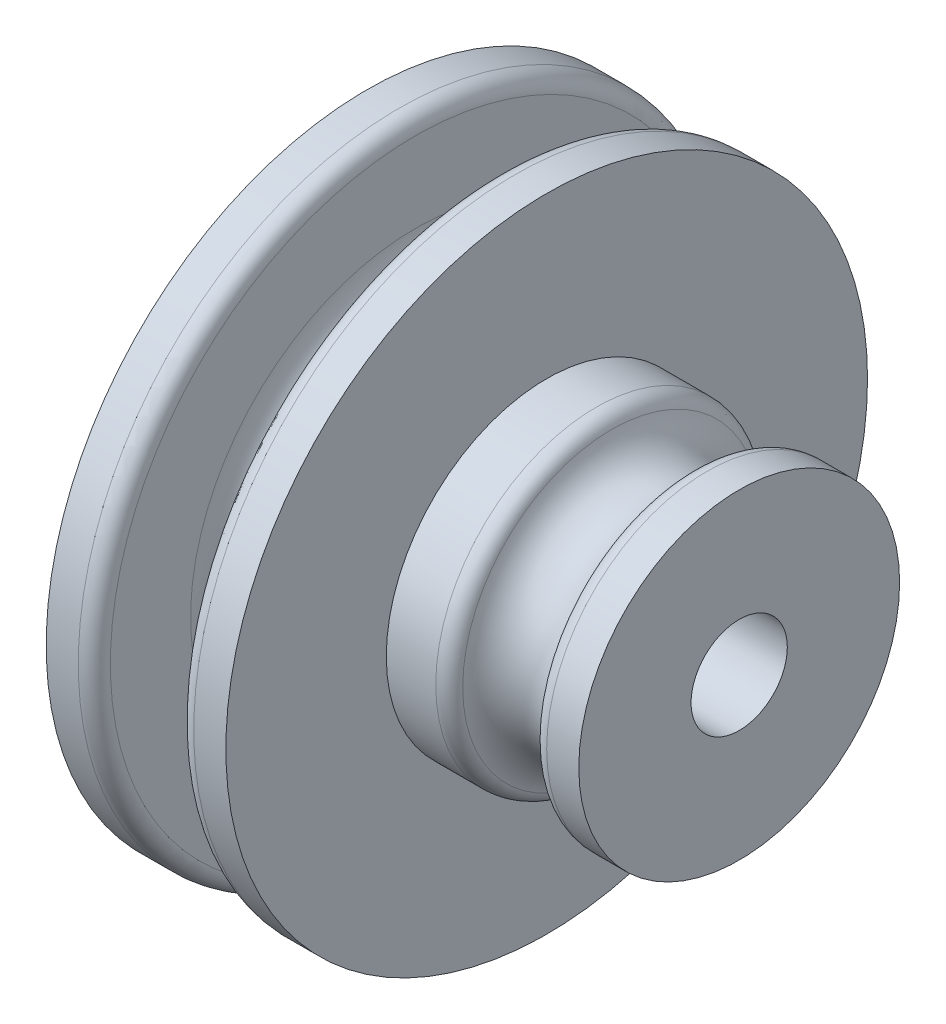
ISO-10303-21;
HEADER;
FILE_DESCRIPTION(('STEP AP214'),'2;1');
FILE_NAME('part.step','',(''),(''),'','','');
FILE_SCHEMA(('AUTOMOTIVE_DESIGN { 1 0 10303 214 1 1 1 1 }'));
ENDSEC;
DATA;
#1=APPLICATION_CONTEXT('core data for automotive mechanical design processes');
#2=APPLICATION_PROTOCOL_DEFINITION('international standard','automotive_design',2000,#1);
#3=PRODUCT_CONTEXT('',#1,'mechanical');
#4=PRODUCT('Part','Part','',(#3));
#5=PRODUCT_RELATED_PRODUCT_CATEGORY('part','',(#4));
#6=PRODUCT_DEFINITION_FORMATION('','',#4);
#7=PRODUCT_DEFINITION_CONTEXT('part definition',#1,'design');
#8=PRODUCT_DEFINITION('design','',#6,#7);
#9=PRODUCT_DEFINITION_SHAPE('','',#8);
#10=(LENGTH_UNIT() NAMED_UNIT(*) SI_UNIT(.MILLI.,.METRE.));
#11=(NAMED_UNIT(*) PLANE_ANGLE_UNIT() SI_UNIT($,.RADIAN.));
#12=(NAMED_UNIT(*) SI_UNIT($,.STERADIAN.) SOLID_ANGLE_UNIT());
#13=UNCERTAINTY_MEASURE_WITH_UNIT(LENGTH_MEASURE(1.E-05),#10,'distance_accuracy_value','');
#14=(GEOMETRIC_REPRESENTATION_CONTEXT(3) GLOBAL_UNCERTAINTY_ASSIGNED_CONTEXT((#13)) GLOBAL_UNIT_ASSIGNED_CONTEXT((#10,
#11,#12)) REPRESENTATION_CONTEXT('',''));
#15=CARTESIAN_POINT('',(0.,0.,0.));
#16=DIRECTION('',(0.,0.,1.));
#17=DIRECTION('',(1.,0.,0.));
#18=AXIS2_PLACEMENT_3D('',#15,#16,#17);
#19=CARTESIAN_POINT('',(4.6,0.,0.));
#20=DIRECTION('',(1.,0.,0.));
#21=DIRECTION('',(0.,0.,-1.));
#22=AXIS2_PLACEMENT_3D('',#19,#20,#21);
#23=TOROIDAL_SURFACE('',#22,9.5,0.5);
#24=CARTESIAN_POINT('',(4.1,0.,0.));
#25=DIRECTION('',(1.,0.,0.));
#26=DIRECTION('',(0.,0.,-1.));
#27=AXIS2_PLACEMENT_3D('',#24,#25,#26);
#28=CIRCLE('',#27,9.5);
#29=CARTESIAN_POINT('',(4.1,0.,-9.5));
#30=VERTEX_POINT('',#29);
#31=EDGE_CURVE('E79',#30,#30,#28,.T.);
#32=ORIENTED_EDGE('',*,*,#31,.T.);
#33=EDGE_LOOP('',(#32));
#34=FACE_BOUND('',#33,.T.);
#35=CARTESIAN_POINT('',(4.6,0.,0.));
#36=DIRECTION('',(1.,0.,0.));
#37=DIRECTION('',(0.,0.,-1.));
#38=AXIS2_PLACEMENT_3D('',#35,#36,#37);
#39=CIRCLE('',#38,10.);
#40=CARTESIAN_POINT('',(4.6,0.,-10.));
#41=VERTEX_POINT('',#40);
#42=EDGE_CURVE('E48',#41,#41,#39,.T.);
#43=ORIENTED_EDGE('',*,*,#42,.F.);
#44=EDGE_LOOP('',(#43));
#45=FACE_BOUND('',#44,.T.);
#46=ADVANCED_FACE('F45',(#34,#45),#23,.T.);
#47=CARTESIAN_POINT('',(11.6,0.,0.));
#48=DIRECTION('',(1.,0.,0.));
#49=DIRECTION('',(0.,0.,-1.));
#50=AXIS2_PLACEMENT_3D('',#47,#48,#49);
#51=CYLINDRICAL_SURFACE('',#50,10.);
#52=ORIENTED_EDGE('',*,*,#42,.T.);
#53=EDGE_LOOP('',(#52));
#54=FACE_BOUND('',#53,.T.);
#55=CARTESIAN_POINT('',(5.6,0.,0.));
#56=DIRECTION('',(1.,0.,0.));
#57=DIRECTION('',(0.,0.,-1.));
#58=AXIS2_PLACEMENT_3D('',#55,#56,#57);
#59=CIRCLE('',#58,10.);
#60=CARTESIAN_POINT('',(5.6,0.,-10.));
#61=VERTEX_POINT('',#60);
#62=EDGE_CURVE('E58',#61,#61,#59,.T.);
#63=ORIENTED_EDGE('',*,*,#62,.F.);
#64=EDGE_LOOP('',(#63));
#65=FACE_BOUND('',#64,.T.);
#66=ADVANCED_FACE('F108',(#54,#65),#51,.T.);
#67=CARTESIAN_POINT('',(5.6,0.,0.));
#68=DIRECTION('',(1.,0.,0.));
#69=DIRECTION('',(0.,0.,-1.));
#70=AXIS2_PLACEMENT_3D('',#67,#68,#69);
#71=PLANE('',#70);
#72=CARTESIAN_POINT('',(5.6,0.,0.));
#73=DIRECTION('',(1.,0.,0.));
#74=DIRECTION('',(0.,0.,-1.));
#75=AXIS2_PLACEMENT_3D('',#72,#73,#74);
#76=CIRCLE('',#75,5.);
#77=CARTESIAN_POINT('',(5.6,0.,-5.));
#78=VERTEX_POINT('',#77);
#79=EDGE_CURVE('E10',#78,#78,#76,.T.);
#80=ORIENTED_EDGE('',*,*,#79,.F.);
#81=EDGE_LOOP('',(#80));
#82=FACE_BOUND('',#81,.T.);
#83=ORIENTED_EDGE('',*,*,#62,.T.);
#84=EDGE_LOOP('',(#83));
#85=FACE_BOUND('',#84,.T.);
#86=ADVANCED_FACE('F106',(#82,#85),#71,.T.);
#87=CARTESIAN_POINT('',(0.,0.,0.));
#88=DIRECTION('',(-1.,0.,0.));
#89=DIRECTION('',(0.,0.,1.));
#90=AXIS2_PLACEMENT_3D('',#87,#88,#89);
#91=PLANE('',#90);
#92=CARTESIAN_POINT('',(0.,0.,0.));
#93=DIRECTION('',(1.,0.,0.));
#94=DIRECTION('',(0.,0.,-1.));
#95=AXIS2_PLACEMENT_3D('',#92,#93,#94);
#96=CIRCLE('',#95,1.5);
#97=CARTESIAN_POINT('',(0.,0.,-1.5));
#98=VERTEX_POINT('',#97);
#99=EDGE_CURVE('E177',#98,#98,#96,.T.);
#100=ORIENTED_EDGE('',*,*,#99,.T.);
#101=EDGE_LOOP('',(#100));
#102=FACE_BOUND('',#101,.T.);
#103=CARTESIAN_POINT('',(0.,0.,0.));
#104=DIRECTION('',(1.,0.,0.));
#105=DIRECTION('',(0.,0.,-1.));
#106=AXIS2_PLACEMENT_3D('',#103,#104,#105);
#107=CIRCLE('',#106,10.);
#108=CARTESIAN_POINT('',(0.,0.,-10.));
#109=VERTEX_POINT('',#108);
#110=EDGE_CURVE('E99',#109,#109,#107,.T.);
#111=ORIENTED_EDGE('',*,*,#110,.F.);
#112=EDGE_LOOP('',(#111));
#113=FACE_BOUND('',#112,.T.);
#114=ADVANCED_FACE('F116',(#102,#113),#91,.T.);
#115=CARTESIAN_POINT('',(11.6,0.,0.));
#116=DIRECTION('',(1.,0.,0.));
#117=DIRECTION('',(0.,0.,-1.));
#118=AXIS2_PLACEMENT_3D('',#115,#116,#117);
#119=CYLINDRICAL_SURFACE('',#118,10.);
#120=ORIENTED_EDGE('',*,*,#110,.T.);
#121=EDGE_LOOP('',(#120));
#122=FACE_BOUND('',#121,.T.);
#123=CARTESIAN_POINT('',(1.,0.,0.));
#124=DIRECTION('',(1.,0.,0.));
#125=DIRECTION('',(0.,0.,-1.));
#126=AXIS2_PLACEMENT_3D('',#123,#124,#125);
#127=CIRCLE('',#126,10.);
#128=CARTESIAN_POINT('',(1.,0.,-10.));
#129=VERTEX_POINT('',#128);
#130=EDGE_CURVE('E95',#129,#129,#127,.T.);
#131=ORIENTED_EDGE('',*,*,#130,.F.);
#132=EDGE_LOOP('',(#131));
#133=FACE_BOUND('',#132,.T.);
#134=ADVANCED_FACE('F123',(#122,#133),#119,.T.);
#135=CARTESIAN_POINT('',(1.00000000000001,0.,0.));
#136=DIRECTION('',(1.,0.,0.));
#137=DIRECTION('',(0.,0.,-1.));
#138=AXIS2_PLACEMENT_3D('',#135,#136,#137);
#139=TOROIDAL_SURFACE('',#138,9.5,0.499999999999999);
#140=ORIENTED_EDGE('',*,*,#130,.T.);
#141=EDGE_LOOP('',(#140));
#142=FACE_BOUND('',#141,.T.);
#143=CARTESIAN_POINT('',(1.5,0.,0.));
#144=DIRECTION('',(1.,0.,0.));
#145=DIRECTION('',(0.,0.,-1.));
#146=AXIS2_PLACEMENT_3D('',#143,#144,#145);
#147=CIRCLE('',#146,9.5);
#148=CARTESIAN_POINT('',(1.5,0.,-9.5));
#149=VERTEX_POINT('',#148);
#150=EDGE_CURVE('E91',#149,#149,#147,.T.);
#151=ORIENTED_EDGE('',*,*,#150,.F.);
#152=EDGE_LOOP('',(#151));
#153=FACE_BOUND('',#152,.T.);
#154=ADVANCED_FACE('F126',(#142,#153),#139,.T.);
#155=CARTESIAN_POINT('',(1.5,0.,0.));
#156=DIRECTION('',(1.,0.,0.));
#157=DIRECTION('',(0.,0.,-1.));
#158=AXIS2_PLACEMENT_3D('',#155,#156,#157);
#159=PLANE('',#158);
#160=ORIENTED_EDGE('',*,*,#150,.T.);
#161=EDGE_LOOP('',(#160));
#162=FACE_BOUND('',#161,.T.);
#163=CARTESIAN_POINT('',(1.5,0.,0.));
#164=DIRECTION('',(1.,0.,0.));
#165=DIRECTION('',(0.,0.,-1.));
#166=AXIS2_PLACEMENT_3D('',#163,#164,#165);
#167=CIRCLE('',#166,7.);
#168=CARTESIAN_POINT('',(1.5,0.,-7.));
#169=VERTEX_POINT('',#168);
#170=EDGE_CURVE('E87',#169,#169,#167,.T.);
#171=ORIENTED_EDGE('',*,*,#170,.F.);
#172=EDGE_LOOP('',(#171));
#173=FACE_BOUND('',#172,.T.);
#174=ADVANCED_FACE('F130',(#162,#173),#159,.T.);
#175=CARTESIAN_POINT('',(2.8,0.,0.));
#176=DIRECTION('',(1.,0.,0.));
#177=DIRECTION('',(0.,0.,-1.));
#178=AXIS2_PLACEMENT_3D('',#175,#176,#177);
#179=TOROIDAL_SURFACE('',#178,7.,1.3);
#180=ORIENTED_EDGE('',*,*,#170,.T.);
#181=EDGE_LOOP('',(#180));
#182=FACE_BOUND('',#181,.T.);
#183=CARTESIAN_POINT('',(4.1,0.,0.));
#184=DIRECTION('',(1.,0.,0.));
#185=DIRECTION('',(0.,0.,-1.));
#186=AXIS2_PLACEMENT_3D('',#183,#184,#185);
#187=CIRCLE('',#186,7.);
#188=CARTESIAN_POINT('',(4.1,0.,-7.));
#189=VERTEX_POINT('',#188);
#190=EDGE_CURVE('E83',#189,#189,#187,.T.);
#191=ORIENTED_EDGE('',*,*,#190,.F.);
#192=EDGE_LOOP('',(#191));
#193=FACE_BOUND('',#192,.T.);
#194=ADVANCED_FACE('F134',(#182,#193),#179,.F.);
#195=CARTESIAN_POINT('',(4.1,0.,0.));
#196=DIRECTION('',(-1.,0.,0.));
#197=DIRECTION('',(0.,0.,1.));
#198=AXIS2_PLACEMENT_3D('',#195,#196,#197);
#199=PLANE('',#198);
#200=ORIENTED_EDGE('',*,*,#190,.T.);
#201=EDGE_LOOP('',(#200));
#202=FACE_BOUND('',#201,.T.);
#203=ORIENTED_EDGE('',*,*,#31,.F.);
#204=EDGE_LOOP('',(#203));
#205=FACE_BOUND('',#204,.T.);
#206=ADVANCED_FACE('F138',(#202,#205),#199,.T.);
#207=CARTESIAN_POINT('',(7.14167670684188,0.,0.));
#208=DIRECTION('',(1.,0.,0.));
#209=DIRECTION('',(0.,0.,-1.));
#210=AXIS2_PLACEMENT_3D('',#207,#208,#209);
#211=TOROIDAL_SURFACE('',#210,4.5,0.499999999999999);
#212=CARTESIAN_POINT('',(7.14167670684188,0.,0.));
#213=DIRECTION('',(1.,0.,0.));
#214=DIRECTION('',(0.,0.,-1.));
#215=AXIS2_PLACEMENT_3D('',#212,#213,#214);
#216=CIRCLE('',#215,5.);
#217=CARTESIAN_POINT('',(7.14167670684188,0.,-5.));
#218=VERTEX_POINT('',#217);
#219=EDGE_CURVE('E61',#218,#218,#216,.T.);
#220=ORIENTED_EDGE('',*,*,#219,.T.);
#221=EDGE_LOOP('',(#220));
#222=FACE_BOUND('',#221,.T.);
#223=CARTESIAN_POINT('',(7.62199938644718,0.,0.));
#224=DIRECTION('',(1.,0.,0.));
#225=DIRECTION('',(0.,0.,-1.));
#226=AXIS2_PLACEMENT_3D('',#223,#224,#225);
#227=CIRCLE('',#226,4.63888888888889);
#228=CARTESIAN_POINT('',(7.62199938644718,0.,-4.63888888888889));
#229=VERTEX_POINT('',#228);
#230=EDGE_CURVE('E75',#229,#229,#227,.T.);
#231=ORIENTED_EDGE('',*,*,#230,.F.);
#232=EDGE_LOOP('',(#231));
#233=FACE_BOUND('',#232,.T.);
#234=ADVANCED_FACE('F142',(#222,#233),#211,.T.);
#235=CARTESIAN_POINT('',(8.87083835342094,0.,0.));
#236=DIRECTION('',(1.,0.,0.));
#237=DIRECTION('',(0.,0.,-1.));
#238=AXIS2_PLACEMENT_3D('',#235,#236,#237);
#239=TOROIDAL_SURFACE('',#238,5.,1.3);
#240=ORIENTED_EDGE('',*,*,#230,.T.);
#241=EDGE_LOOP('',(#240));
#242=FACE_BOUND('',#241,.T.);
#243=CARTESIAN_POINT('',(10.1196773203947,0.,0.));
#244=DIRECTION('',(1.,0.,0.));
#245=DIRECTION('',(0.,0.,-1.));
#246=AXIS2_PLACEMENT_3D('',#243,#244,#245);
#247=CIRCLE('',#246,4.63888888888889);
#248=CARTESIAN_POINT('',(10.1196773203947,0.,-4.63888888888889));
#249=VERTEX_POINT('',#248);
#250=EDGE_CURVE('E71',#249,#249,#247,.T.);
#251=ORIENTED_EDGE('',*,*,#250,.F.);
#252=EDGE_LOOP('',(#251));
#253=FACE_BOUND('',#252,.T.);
#254=ADVANCED_FACE('F146',(#242,#253),#239,.F.);
#255=CARTESIAN_POINT('',(10.6,0.,0.));
#256=DIRECTION('',(1.,0.,0.));
#257=DIRECTION('',(0.,0.,-1.));
#258=AXIS2_PLACEMENT_3D('',#255,#256,#257);
#259=TOROIDAL_SURFACE('',#258,4.5,0.5);
#260=ORIENTED_EDGE('',*,*,#250,.T.);
#261=EDGE_LOOP('',(#260));
#262=FACE_BOUND('',#261,.T.);
#263=CARTESIAN_POINT('',(10.6,0.,0.));
#264=DIRECTION('',(1.,0.,0.));
#265=DIRECTION('',(0.,0.,-1.));
#266=AXIS2_PLACEMENT_3D('',#263,#264,#265);
#267=CIRCLE('',#266,5.);
#268=CARTESIAN_POINT('',(10.6,0.,-5.));
#269=VERTEX_POINT('',#268);
#270=EDGE_CURVE('E67',#269,#269,#267,.T.);
#271=ORIENTED_EDGE('',*,*,#270,.F.);
#272=EDGE_LOOP('',(#271));
#273=FACE_BOUND('',#272,.T.);
#274=ADVANCED_FACE('F150',(#262,#273),#259,.T.);
#275=CARTESIAN_POINT('',(11.6,0.,0.));
#276=DIRECTION('',(1.,0.,0.));
#277=DIRECTION('',(0.,0.,-1.));
#278=AXIS2_PLACEMENT_3D('',#275,#276,#277);
#279=CYLINDRICAL_SURFACE('',#278,5.);
#280=ORIENTED_EDGE('',*,*,#270,.T.);
#281=EDGE_LOOP('',(#280));
#282=FACE_BOUND('',#281,.T.);
#283=CARTESIAN_POINT('',(11.6,0.,0.));
#284=DIRECTION('',(1.,0.,0.));
#285=DIRECTION('',(0.,0.,-1.));
#286=AXIS2_PLACEMENT_3D('',#283,#284,#285);
#287=CIRCLE('',#286,5.);
#288=CARTESIAN_POINT('',(11.6,0.,-5.));
#289=VERTEX_POINT('',#288);
#290=EDGE_CURVE('E63',#289,#289,#287,.T.);
#291=ORIENTED_EDGE('',*,*,#290,.F.);
#292=EDGE_LOOP('',(#291));
#293=FACE_BOUND('',#292,.T.);
#294=ADVANCED_FACE('F154',(#282,#293),#279,.T.);
#295=CARTESIAN_POINT('',(11.6,0.,0.));
#296=DIRECTION('',(1.,0.,0.));
#297=DIRECTION('',(0.,0.,-1.));
#298=AXIS2_PLACEMENT_3D('',#295,#296,#297);
#299=PLANE('',#298);
#300=CARTESIAN_POINT('',(11.6,0.,0.));
#301=DIRECTION('',(1.,0.,0.));
#302=DIRECTION('',(0.,0.,-1.));
#303=AXIS2_PLACEMENT_3D('',#300,#301,#302);
#304=CIRCLE('',#303,1.5);
#305=CARTESIAN_POINT('',(11.6,0.,-1.5));
#306=VERTEX_POINT('',#305);
#307=EDGE_CURVE('E174',#306,#306,#304,.T.);
#308=ORIENTED_EDGE('',*,*,#307,.F.);
#309=EDGE_LOOP('',(#308));
#310=FACE_BOUND('',#309,.T.);
#311=ORIENTED_EDGE('',*,*,#290,.T.);
#312=EDGE_LOOP('',(#311));
#313=FACE_BOUND('',#312,.T.);
#314=ADVANCED_FACE('F158',(#310,#313),#299,.T.);
#315=CARTESIAN_POINT('',(11.6,0.,0.));
#316=DIRECTION('',(1.,0.,0.));
#317=DIRECTION('',(0.,0.,-1.));
#318=AXIS2_PLACEMENT_3D('',#315,#316,#317);
#319=CYLINDRICAL_SURFACE('',#318,5.);
#320=ORIENTED_EDGE('',*,*,#79,.T.);
#321=EDGE_LOOP('',(#320));
#322=FACE_BOUND('',#321,.T.);
#323=ORIENTED_EDGE('',*,*,#219,.F.);
#324=EDGE_LOOP('',(#323));
#325=FACE_BOUND('',#324,.T.);
#326=ADVANCED_FACE('F162',(#322,#325),#319,.T.);
#327=CARTESIAN_POINT('',(11.6,0.,0.));
#328=DIRECTION('',(-1.,0.,0.));
#329=DIRECTION('',(0.,0.,1.));
#330=AXIS2_PLACEMENT_3D('',#327,#328,#329);
#331=CYLINDRICAL_SURFACE('',#330,1.5);
#332=ORIENTED_EDGE('',*,*,#307,.T.);
#333=EDGE_LOOP('',(#332));
#334=FACE_BOUND('',#333,.T.);
#335=ORIENTED_EDGE('',*,*,#99,.F.);
#336=EDGE_LOOP('',(#335));
#337=FACE_BOUND('',#336,.T.);
#338=ADVANCED_FACE('F166',(#334,#337),#331,.F.);
#339=CLOSED_SHELL('',(#46,#66,#86,#114,#134,#154,#174,#194,#206,#234,#254,#274,#294,#314,#326,#338));
#340=MANIFOLD_SOLID_BREP('B2',#339);
#341=ADVANCED_BREP_SHAPE_REPRESENTATION('',(#18,#340),#14);
#342=SHAPE_DEFINITION_REPRESENTATION(#9,#341);
ENDSEC;
END-ISO-10303-21;
